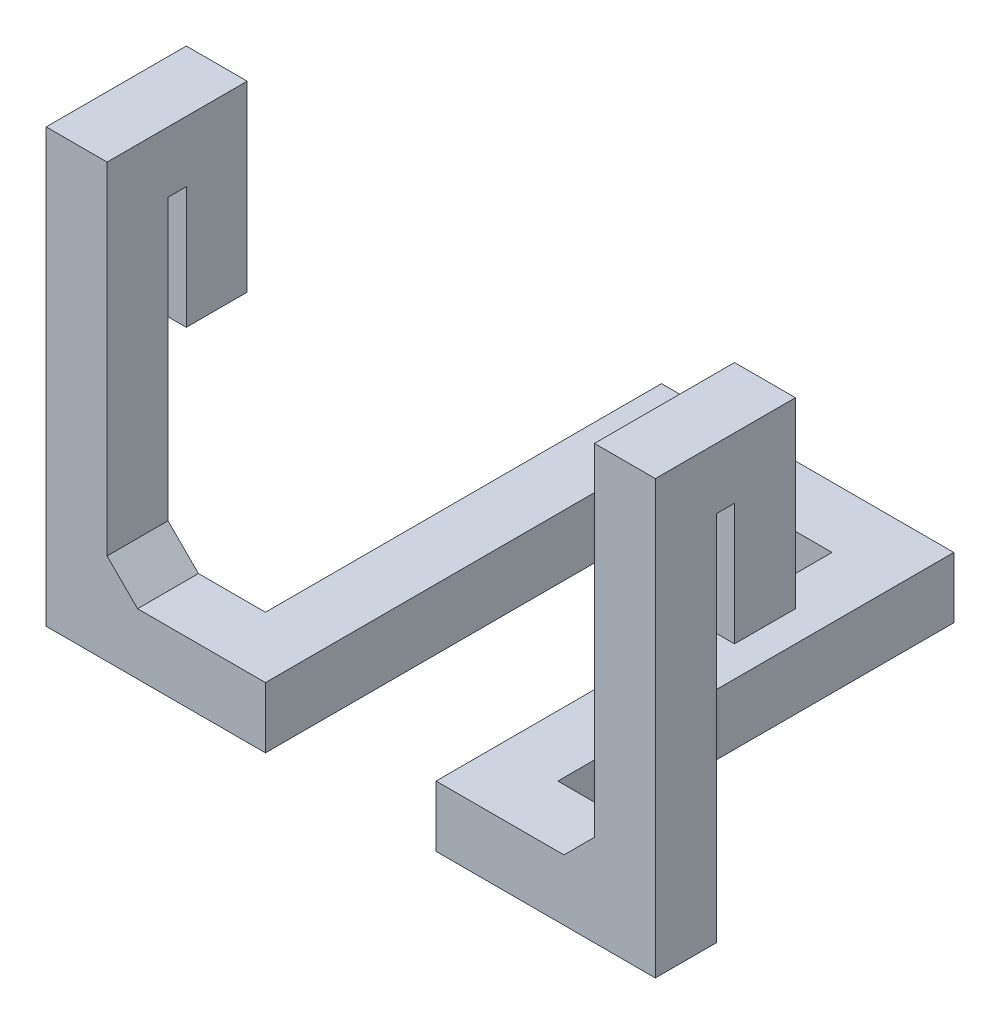
ISO-10303-21;
HEADER;
FILE_DESCRIPTION(('STEP AP214'),'2;1');
FILE_NAME('part.step','',(''),(''),'','','');
FILE_SCHEMA(('AUTOMOTIVE_DESIGN { 1 0 10303 214 1 1 1 1 }'));
ENDSEC;
DATA;
#1=APPLICATION_CONTEXT('core data for automotive mechanical design processes');
#2=APPLICATION_PROTOCOL_DEFINITION('international standard','automotive_design',2000,#1);
#3=PRODUCT_CONTEXT('',#1,'mechanical');
#4=PRODUCT('Part','Part','',(#3));
#5=PRODUCT_RELATED_PRODUCT_CATEGORY('part','',(#4));
#6=PRODUCT_DEFINITION_FORMATION('','',#4);
#7=PRODUCT_DEFINITION_CONTEXT('part definition',#1,'design');
#8=PRODUCT_DEFINITION('design','',#6,#7);
#9=PRODUCT_DEFINITION_SHAPE('','',#8);
#10=(LENGTH_UNIT() NAMED_UNIT(*) SI_UNIT(.MILLI.,.METRE.));
#11=(NAMED_UNIT(*) PLANE_ANGLE_UNIT() SI_UNIT($,.RADIAN.));
#12=(NAMED_UNIT(*) SI_UNIT($,.STERADIAN.) SOLID_ANGLE_UNIT());
#13=UNCERTAINTY_MEASURE_WITH_UNIT(LENGTH_MEASURE(1.E-05),#10,'distance_accuracy_value','');
#14=(GEOMETRIC_REPRESENTATION_CONTEXT(3) GLOBAL_UNCERTAINTY_ASSIGNED_CONTEXT((#13)) GLOBAL_UNIT_ASSIGNED_CONTEXT((#10,
#11,#12)) REPRESENTATION_CONTEXT('',''));
#15=CARTESIAN_POINT('',(0.,0.,0.));
#16=DIRECTION('',(0.,0.,1.));
#17=DIRECTION('',(1.,0.,0.));
#18=AXIS2_PLACEMENT_3D('',#15,#16,#17);
#19=CARTESIAN_POINT('',(10.,0.,0.));
#20=DIRECTION('',(0.,1.,0.));
#21=DIRECTION('',(0.,0.,1.));
#22=AXIS2_PLACEMENT_3D('',#19,#20,#21);
#23=PLANE('',#22);
#24=DIRECTION('',(0.,0.,-1.));
#25=VECTOR('',#24,1.);
#26=CARTESIAN_POINT('',(0.,0.,0.));
#27=LINE('',#26,#25);
#28=CARTESIAN_POINT('',(0.,0.,0.));
#29=VERTEX_POINT('',#28);
#30=CARTESIAN_POINT('',(0.,0.,-10.));
#31=VERTEX_POINT('',#30);
#32=EDGE_CURVE('E348',#29,#31,#27,.T.);
#33=ORIENTED_EDGE('',*,*,#32,.T.);
#34=DIRECTION('',(-1.,0.,0.));
#35=VECTOR('',#34,1.);
#36=CARTESIAN_POINT('',(10.,0.,-10.));
#37=LINE('',#36,#35);
#38=CARTESIAN_POINT('',(26.,0.,-10.));
#39=VERTEX_POINT('',#38);
#40=EDGE_CURVE('E400',#39,#31,#37,.T.);
#41=ORIENTED_EDGE('',*,*,#40,.F.);
#42=DIRECTION('',(0.,0.,1.));
#43=VECTOR('',#42,1.);
#44=CARTESIAN_POINT('',(26.,0.,-10.));
#45=LINE('',#44,#43);
#46=CARTESIAN_POINT('',(26.,0.,-75.));
#47=VERTEX_POINT('',#46);
#48=EDGE_CURVE('E293',#47,#39,#45,.T.);
#49=ORIENTED_EDGE('',*,*,#48,.F.);
#50=DIRECTION('',(-1.,0.,0.));
#51=VECTOR('',#50,1.);
#52=CARTESIAN_POINT('',(26.,0.,-75.));
#53=LINE('',#52,#51);
#54=CARTESIAN_POINT('',(74.,0.,-75.));
#55=VERTEX_POINT('',#54);
#56=EDGE_CURVE('E322',#55,#47,#53,.T.);
#57=ORIENTED_EDGE('',*,*,#56,.F.);
#58=DIRECTION('',(0.,0.,-1.));
#59=VECTOR('',#58,1.);
#60=CARTESIAN_POINT('',(74.,0.,-10.));
#61=LINE('',#60,#59);
#62=CARTESIAN_POINT('',(74.,0.,-10.));
#63=VERTEX_POINT('',#62);
#64=EDGE_CURVE('E229',#63,#55,#61,.T.);
#65=ORIENTED_EDGE('',*,*,#64,.F.);
#66=DIRECTION('',(-1.,0.,0.));
#67=VECTOR('',#66,1.);
#68=CARTESIAN_POINT('',(90.,0.,-10.));
#69=LINE('',#68,#67);
#70=CARTESIAN_POINT('',(100.,0.,-10.));
#71=VERTEX_POINT('',#70);
#72=EDGE_CURVE('E222',#71,#63,#69,.T.);
#73=ORIENTED_EDGE('',*,*,#72,.F.);
#74=DIRECTION('',(0.,0.,-1.));
#75=VECTOR('',#74,1.);
#76=CARTESIAN_POINT('',(100.,0.,0.));
#77=LINE('',#76,#75);
#78=CARTESIAN_POINT('',(100.,0.,0.));
#79=VERTEX_POINT('',#78);
#80=EDGE_CURVE('E227',#79,#71,#77,.T.);
#81=ORIENTED_EDGE('',*,*,#80,.F.);
#82=DIRECTION('',(1.,0.,0.));
#83=VECTOR('',#82,1.);
#84=CARTESIAN_POINT('',(90.,0.,0.));
#85=LINE('',#84,#83);
#86=CARTESIAN_POINT('',(64.,0.,0.));
#87=VERTEX_POINT('',#86);
#88=EDGE_CURVE('E232',#87,#79,#85,.T.);
#89=ORIENTED_EDGE('',*,*,#88,.F.);
#90=DIRECTION('',(0.,0.,1.));
#91=VECTOR('',#90,1.);
#92=CARTESIAN_POINT('',(64.,0.,0.));
#93=LINE('',#92,#91);
#94=CARTESIAN_POINT('',(64.,0.,-65.));
#95=VERTEX_POINT('',#94);
#96=EDGE_CURVE('E318',#95,#87,#93,.T.);
#97=ORIENTED_EDGE('',*,*,#96,.F.);
#98=DIRECTION('',(1.,0.,0.));
#99=VECTOR('',#98,1.);
#100=CARTESIAN_POINT('',(64.,0.,-65.));
#101=LINE('',#100,#99);
#102=CARTESIAN_POINT('',(36.,0.,-65.));
#103=VERTEX_POINT('',#102);
#104=EDGE_CURVE('E316',#103,#95,#101,.T.);
#105=ORIENTED_EDGE('',*,*,#104,.F.);
#106=DIRECTION('',(0.,0.,-1.));
#107=VECTOR('',#106,1.);
#108=CARTESIAN_POINT('',(36.,0.,0.));
#109=LINE('',#108,#107);
#110=CARTESIAN_POINT('',(36.,0.,0.));
#111=VERTEX_POINT('',#110);
#112=EDGE_CURVE('E289',#111,#103,#109,.T.);
#113=ORIENTED_EDGE('',*,*,#112,.F.);
#114=DIRECTION('',(-1.,0.,0.));
#115=VECTOR('',#114,1.);
#116=CARTESIAN_POINT('',(10.,0.,0.));
#117=LINE('',#116,#115);
#118=EDGE_CURVE('E365',#111,#29,#117,.T.);
#119=ORIENTED_EDGE('',*,*,#118,.T.);
#120=EDGE_LOOP('',(#33,#41,#49,#57,#65,#73,#81,#89,#97,#105,#113,#119));
#121=FACE_BOUND('',#120,.T.);
#122=ADVANCED_FACE('F49',(#121),#23,.F.);
#123=CARTESIAN_POINT('',(10.,0.,-10.));
#124=DIRECTION('',(0.,0.,1.));
#125=DIRECTION('',(1.,0.,0.));
#126=AXIS2_PLACEMENT_3D('',#123,#124,#125);
#127=PLANE('',#126);
#128=DIRECTION('',(0.,1.,0.));
#129=VECTOR('',#128,1.);
#130=CARTESIAN_POINT('',(0.,0.,-10.));
#131=LINE('',#130,#129);
#132=CARTESIAN_POINT('',(0.,61.,-10.));
#133=VERTEX_POINT('',#132);
#134=EDGE_CURVE('E367',#31,#133,#131,.T.);
#135=ORIENTED_EDGE('',*,*,#134,.T.);
#136=DIRECTION('',(-1.,0.,0.));
#137=VECTOR('',#136,1.);
#138=CARTESIAN_POINT('',(10.,61.,-10.));
#139=LINE('',#138,#137);
#140=CARTESIAN_POINT('',(10.,61.,-10.));
#141=VERTEX_POINT('',#140);
#142=EDGE_CURVE('E397',#141,#133,#139,.T.);
#143=ORIENTED_EDGE('',*,*,#142,.F.);
#144=DIRECTION('',(0.,1.,0.));
#145=VECTOR('',#144,1.);
#146=CARTESIAN_POINT('',(10.,0.,-10.));
#147=LINE('',#146,#145);
#148=CARTESIAN_POINT('',(10.,15.,-10.));
#149=VERTEX_POINT('',#148);
#150=EDGE_CURVE('E349',#149,#141,#147,.T.);
#151=ORIENTED_EDGE('',*,*,#150,.F.);
#152=DIRECTION('',(-0.707106781186548,0.707106781186548,0.));
#153=VECTOR('',#152,1.);
#154=CARTESIAN_POINT('',(17.5,7.5,-10.));
#155=LINE('',#154,#153);
#156=CARTESIAN_POINT('',(15.,10.,-10.));
#157=VERTEX_POINT('',#156);
#158=EDGE_CURVE('E414',#149,#157,#155,.F.);
#159=ORIENTED_EDGE('',*,*,#158,.T.);
#160=DIRECTION('',(-1.,0.,0.));
#161=VECTOR('',#160,1.);
#162=CARTESIAN_POINT('',(10.,10.,-10.));
#163=LINE('',#162,#161);
#164=CARTESIAN_POINT('',(26.,10.,-10.));
#165=VERTEX_POINT('',#164);
#166=EDGE_CURVE('E310',#165,#157,#163,.T.);
#167=ORIENTED_EDGE('',*,*,#166,.F.);
#168=DIRECTION('',(0.,-1.,0.));
#169=VECTOR('',#168,1.);
#170=CARTESIAN_POINT('',(26.,10.,-10.));
#171=LINE('',#170,#169);
#172=EDGE_CURVE('E313',#165,#39,#171,.T.);
#173=ORIENTED_EDGE('',*,*,#172,.T.);
#174=ORIENTED_EDGE('',*,*,#40,.T.);
#175=EDGE_LOOP('',(#135,#143,#151,#159,#167,#173,#174));
#176=FACE_BOUND('',#175,.T.);
#177=ADVANCED_FACE('F419',(#176),#127,.F.);
#178=CARTESIAN_POINT('',(10.,61.,-10.));
#179=DIRECTION('',(0.,1.,0.));
#180=DIRECTION('',(0.,0.,1.));
#181=AXIS2_PLACEMENT_3D('',#178,#179,#180);
#182=PLANE('',#181);
#183=DIRECTION('',(0.,0.,-1.));
#184=VECTOR('',#183,1.);
#185=CARTESIAN_POINT('',(0.,61.,-10.));
#186=LINE('',#185,#184);
#187=CARTESIAN_POINT('',(0.,61.,-13.));
#188=VERTEX_POINT('',#187);
#189=EDGE_CURVE('E369',#133,#188,#186,.T.);
#190=ORIENTED_EDGE('',*,*,#189,.T.);
#191=DIRECTION('',(-1.,0.,0.));
#192=VECTOR('',#191,1.);
#193=CARTESIAN_POINT('',(10.,61.,-13.));
#194=LINE('',#193,#192);
#195=CARTESIAN_POINT('',(10.,61.,-13.));
#196=VERTEX_POINT('',#195);
#197=EDGE_CURVE('E394',#196,#188,#194,.T.);
#198=ORIENTED_EDGE('',*,*,#197,.F.);
#199=DIRECTION('',(0.,0.,-1.));
#200=VECTOR('',#199,1.);
#201=CARTESIAN_POINT('',(10.,61.,-10.));
#202=LINE('',#201,#200);
#203=EDGE_CURVE('E351',#141,#196,#202,.T.);
#204=ORIENTED_EDGE('',*,*,#203,.F.);
#205=ORIENTED_EDGE('',*,*,#142,.T.);
#206=EDGE_LOOP('',(#190,#198,#204,#205));
#207=FACE_BOUND('',#206,.T.);
#208=ADVANCED_FACE('F482',(#207),#182,.F.);
#209=CARTESIAN_POINT('',(10.,61.,-13.));
#210=DIRECTION('',(0.,0.,-1.));
#211=DIRECTION('',(0.,1.,0.));
#212=AXIS2_PLACEMENT_3D('',#209,#210,#211);
#213=PLANE('',#212);
#214=DIRECTION('',(0.,-1.,0.));
#215=VECTOR('',#214,1.);
#216=CARTESIAN_POINT('',(0.,61.,-13.));
#217=LINE('',#216,#215);
#218=CARTESIAN_POINT('',(0.,41.,-13.));
#219=VERTEX_POINT('',#218);
#220=EDGE_CURVE('E371',#188,#219,#217,.T.);
#221=ORIENTED_EDGE('',*,*,#220,.T.);
#222=DIRECTION('',(-1.,0.,0.));
#223=VECTOR('',#222,1.);
#224=CARTESIAN_POINT('',(10.,41.,-13.));
#225=LINE('',#224,#223);
#226=CARTESIAN_POINT('',(10.,41.,-13.));
#227=VERTEX_POINT('',#226);
#228=EDGE_CURVE('E391',#227,#219,#225,.T.);
#229=ORIENTED_EDGE('',*,*,#228,.F.);
#230=DIRECTION('',(0.,-1.,0.));
#231=VECTOR('',#230,1.);
#232=CARTESIAN_POINT('',(10.,61.,-13.));
#233=LINE('',#232,#231);
#234=EDGE_CURVE('E354',#196,#227,#233,.T.);
#235=ORIENTED_EDGE('',*,*,#234,.F.);
#236=ORIENTED_EDGE('',*,*,#197,.T.);
#237=EDGE_LOOP('',(#221,#229,#235,#236));
#238=FACE_BOUND('',#237,.T.);
#239=ADVANCED_FACE('F492',(#238),#213,.F.);
#240=CARTESIAN_POINT('',(10.,41.,-13.));
#241=DIRECTION('',(0.,1.,0.));
#242=DIRECTION('',(0.,0.,1.));
#243=AXIS2_PLACEMENT_3D('',#240,#241,#242);
#244=PLANE('',#243);
#245=DIRECTION('',(0.,0.,-1.));
#246=VECTOR('',#245,1.);
#247=CARTESIAN_POINT('',(0.,41.,-13.));
#248=LINE('',#247,#246);
#249=CARTESIAN_POINT('',(0.,41.,-23.));
#250=VERTEX_POINT('',#249);
#251=EDGE_CURVE('E373',#219,#250,#248,.T.);
#252=ORIENTED_EDGE('',*,*,#251,.T.);
#253=DIRECTION('',(-1.,0.,0.));
#254=VECTOR('',#253,1.);
#255=CARTESIAN_POINT('',(10.,41.,-23.));
#256=LINE('',#255,#254);
#257=CARTESIAN_POINT('',(10.,41.,-23.));
#258=VERTEX_POINT('',#257);
#259=EDGE_CURVE('E388',#258,#250,#256,.T.);
#260=ORIENTED_EDGE('',*,*,#259,.F.);
#261=DIRECTION('',(0.,0.,-1.));
#262=VECTOR('',#261,1.);
#263=CARTESIAN_POINT('',(10.,41.,-13.));
#264=LINE('',#263,#262);
#265=EDGE_CURVE('E356',#227,#258,#264,.T.);
#266=ORIENTED_EDGE('',*,*,#265,.F.);
#267=ORIENTED_EDGE('',*,*,#228,.T.);
#268=EDGE_LOOP('',(#252,#260,#266,#267));
#269=FACE_BOUND('',#268,.T.);
#270=ADVANCED_FACE('F496',(#269),#244,.F.);
#271=CARTESIAN_POINT('',(10.,71.,-23.));
#272=DIRECTION('',(0.,0.,1.));
#273=DIRECTION('',(1.,0.,0.));
#274=AXIS2_PLACEMENT_3D('',#271,#272,#273);
#275=PLANE('',#274);
#276=DIRECTION('',(0.,1.,0.));
#277=VECTOR('',#276,1.);
#278=CARTESIAN_POINT('',(0.,71.,-23.));
#279=LINE('',#278,#277);
#280=CARTESIAN_POINT('',(0.,71.,-23.));
#281=VERTEX_POINT('',#280);
#282=EDGE_CURVE('E375',#250,#281,#279,.T.);
#283=ORIENTED_EDGE('',*,*,#282,.T.);
#284=DIRECTION('',(-1.,0.,0.));
#285=VECTOR('',#284,1.);
#286=CARTESIAN_POINT('',(10.,71.,-23.));
#287=LINE('',#286,#285);
#288=CARTESIAN_POINT('',(10.,71.,-23.));
#289=VERTEX_POINT('',#288);
#290=EDGE_CURVE('E385',#289,#281,#287,.T.);
#291=ORIENTED_EDGE('',*,*,#290,.F.);
#292=DIRECTION('',(0.,1.,0.));
#293=VECTOR('',#292,1.);
#294=CARTESIAN_POINT('',(10.,71.,-23.));
#295=LINE('',#294,#293);
#296=EDGE_CURVE('E358',#258,#289,#295,.T.);
#297=ORIENTED_EDGE('',*,*,#296,.F.);
#298=ORIENTED_EDGE('',*,*,#259,.T.);
#299=EDGE_LOOP('',(#283,#291,#297,#298));
#300=FACE_BOUND('',#299,.T.);
#301=ADVANCED_FACE('F500',(#300),#275,.F.);
#302=CARTESIAN_POINT('',(10.,71.,0.));
#303=DIRECTION('',(0.,-1.,0.));
#304=DIRECTION('',(0.,0.,-1.));
#305=AXIS2_PLACEMENT_3D('',#302,#303,#304);
#306=PLANE('',#305);
#307=DIRECTION('',(0.,0.,1.));
#308=VECTOR('',#307,1.);
#309=CARTESIAN_POINT('',(0.,71.,0.));
#310=LINE('',#309,#308);
#311=CARTESIAN_POINT('',(0.,71.,0.));
#312=VERTEX_POINT('',#311);
#313=EDGE_CURVE('E377',#281,#312,#310,.T.);
#314=ORIENTED_EDGE('',*,*,#313,.T.);
#315=DIRECTION('',(-1.,0.,0.));
#316=VECTOR('',#315,1.);
#317=CARTESIAN_POINT('',(10.,71.,0.));
#318=LINE('',#317,#316);
#319=CARTESIAN_POINT('',(10.,71.,0.));
#320=VERTEX_POINT('',#319);
#321=EDGE_CURVE('E382',#320,#312,#318,.T.);
#322=ORIENTED_EDGE('',*,*,#321,.F.);
#323=DIRECTION('',(0.,0.,1.));
#324=VECTOR('',#323,1.);
#325=CARTESIAN_POINT('',(10.,71.,0.));
#326=LINE('',#325,#324);
#327=EDGE_CURVE('E360',#289,#320,#326,.T.);
#328=ORIENTED_EDGE('',*,*,#327,.F.);
#329=ORIENTED_EDGE('',*,*,#290,.T.);
#330=EDGE_LOOP('',(#314,#322,#328,#329));
#331=FACE_BOUND('',#330,.T.);
#332=ADVANCED_FACE('F441',(#331),#306,.F.);
#333=CARTESIAN_POINT('',(10.,0.,0.));
#334=DIRECTION('',(0.,0.,-1.));
#335=DIRECTION('',(-1.,0.,0.));
#336=AXIS2_PLACEMENT_3D('',#333,#334,#335);
#337=PLANE('',#336);
#338=DIRECTION('',(0.,-1.,0.));
#339=VECTOR('',#338,1.);
#340=CARTESIAN_POINT('',(0.,0.,0.));
#341=LINE('',#340,#339);
#342=EDGE_CURVE('E352',#312,#29,#341,.T.);
#343=ORIENTED_EDGE('',*,*,#342,.T.);
#344=ORIENTED_EDGE('',*,*,#118,.F.);
#345=DIRECTION('',(0.,-1.,0.));
#346=VECTOR('',#345,1.);
#347=CARTESIAN_POINT('',(36.,10.,0.));
#348=LINE('',#347,#346);
#349=CARTESIAN_POINT('',(36.,10.,0.));
#350=VERTEX_POINT('',#349);
#351=EDGE_CURVE('E345',#350,#111,#348,.T.);
#352=ORIENTED_EDGE('',*,*,#351,.F.);
#353=DIRECTION('',(1.,0.,0.));
#354=VECTOR('',#353,1.);
#355=CARTESIAN_POINT('',(10.,10.,0.));
#356=LINE('',#355,#354);
#357=CARTESIAN_POINT('',(15.,10.,0.));
#358=VERTEX_POINT('',#357);
#359=EDGE_CURVE('E290',#358,#350,#356,.T.);
#360=ORIENTED_EDGE('',*,*,#359,.F.);
#361=DIRECTION('',(0.707106781186548,-0.707106781186548,0.));
#362=VECTOR('',#361,1.);
#363=CARTESIAN_POINT('',(17.5,7.5,0.));
#364=LINE('',#363,#362);
#365=CARTESIAN_POINT('',(10.,15.,0.));
#366=VERTEX_POINT('',#365);
#367=EDGE_CURVE('E412',#358,#366,#364,.F.);
#368=ORIENTED_EDGE('',*,*,#367,.T.);
#369=DIRECTION('',(0.,-1.,0.));
#370=VECTOR('',#369,1.);
#371=CARTESIAN_POINT('',(10.,0.,0.));
#372=LINE('',#371,#370);
#373=EDGE_CURVE('E362',#320,#366,#372,.T.);
#374=ORIENTED_EDGE('',*,*,#373,.F.);
#375=ORIENTED_EDGE('',*,*,#321,.T.);
#376=EDGE_LOOP('',(#343,#344,#352,#360,#368,#374,#375));
#377=FACE_BOUND('',#376,.T.);
#378=ADVANCED_FACE('F432',(#377),#337,.F.);
#379=CARTESIAN_POINT('',(10.,0.,0.));
#380=DIRECTION('',(1.,0.,0.));
#381=DIRECTION('',(0.,0.,-1.));
#382=AXIS2_PLACEMENT_3D('',#379,#380,#381);
#383=PLANE('',#382);
#384=ORIENTED_EDGE('',*,*,#373,.T.);
#385=DIRECTION('',(0.,0.,-1.));
#386=VECTOR('',#385,1.);
#387=CARTESIAN_POINT('',(10.,15.,-10.));
#388=LINE('',#387,#386);
#389=EDGE_CURVE('E409',#366,#149,#388,.T.);
#390=ORIENTED_EDGE('',*,*,#389,.T.);
#391=ORIENTED_EDGE('',*,*,#150,.T.);
#392=ORIENTED_EDGE('',*,*,#203,.T.);
#393=ORIENTED_EDGE('',*,*,#234,.T.);
#394=ORIENTED_EDGE('',*,*,#265,.T.);
#395=ORIENTED_EDGE('',*,*,#296,.T.);
#396=ORIENTED_EDGE('',*,*,#327,.T.);
#397=EDGE_LOOP('',(#384,#390,#391,#392,#393,#394,#395,#396));
#398=FACE_BOUND('',#397,.T.);
#399=ADVANCED_FACE('F435',(#398),#383,.T.);
#400=CARTESIAN_POINT('',(0.,0.,0.));
#401=DIRECTION('',(1.,0.,0.));
#402=DIRECTION('',(0.,0.,-1.));
#403=AXIS2_PLACEMENT_3D('',#400,#401,#402);
#404=PLANE('',#403);
#405=ORIENTED_EDGE('',*,*,#32,.F.);
#406=ORIENTED_EDGE('',*,*,#342,.F.);
#407=ORIENTED_EDGE('',*,*,#313,.F.);
#408=ORIENTED_EDGE('',*,*,#282,.F.);
#409=ORIENTED_EDGE('',*,*,#251,.F.);
#410=ORIENTED_EDGE('',*,*,#220,.F.);
#411=ORIENTED_EDGE('',*,*,#189,.F.);
#412=ORIENTED_EDGE('',*,*,#134,.F.);
#413=EDGE_LOOP('',(#405,#406,#407,#408,#409,#410,#411,#412));
#414=FACE_BOUND('',#413,.T.);
#415=ADVANCED_FACE('F446',(#414),#404,.F.);
#416=CARTESIAN_POINT('',(36.,10.,0.));
#417=DIRECTION('',(-1.,0.,0.));
#418=DIRECTION('',(0.,0.,1.));
#419=AXIS2_PLACEMENT_3D('',#416,#417,#418);
#420=PLANE('',#419);
#421=ORIENTED_EDGE('',*,*,#112,.T.);
#422=DIRECTION('',(0.,-1.,0.));
#423=VECTOR('',#422,1.);
#424=CARTESIAN_POINT('',(36.,10.,-65.));
#425=LINE('',#424,#423);
#426=CARTESIAN_POINT('',(36.,10.,-65.));
#427=VERTEX_POINT('',#426);
#428=EDGE_CURVE('E342',#427,#103,#425,.T.);
#429=ORIENTED_EDGE('',*,*,#428,.F.);
#430=DIRECTION('',(0.,0.,-1.));
#431=VECTOR('',#430,1.);
#432=CARTESIAN_POINT('',(36.,10.,0.));
#433=LINE('',#432,#431);
#434=EDGE_CURVE('E292',#350,#427,#433,.T.);
#435=ORIENTED_EDGE('',*,*,#434,.F.);
#436=ORIENTED_EDGE('',*,*,#351,.T.);
#437=EDGE_LOOP('',(#421,#429,#435,#436));
#438=FACE_BOUND('',#437,.T.);
#439=ADVANCED_FACE('F453',(#438),#420,.F.);
#440=CARTESIAN_POINT('',(64.,10.,-65.));
#441=DIRECTION('',(0.,0.,-1.));
#442=DIRECTION('',(-1.,0.,0.));
#443=AXIS2_PLACEMENT_3D('',#440,#441,#442);
#444=PLANE('',#443);
#445=ORIENTED_EDGE('',*,*,#104,.T.);
#446=DIRECTION('',(0.,-1.,0.));
#447=VECTOR('',#446,1.);
#448=CARTESIAN_POINT('',(64.,10.,-65.));
#449=LINE('',#448,#447);
#450=CARTESIAN_POINT('',(64.,10.,-65.));
#451=VERTEX_POINT('',#450);
#452=EDGE_CURVE('E339',#451,#95,#449,.T.);
#453=ORIENTED_EDGE('',*,*,#452,.F.);
#454=DIRECTION('',(1.,0.,0.));
#455=VECTOR('',#454,1.);
#456=CARTESIAN_POINT('',(36.,10.,-65.));
#457=LINE('',#456,#455);
#458=EDGE_CURVE('E295',#427,#451,#457,.T.);
#459=ORIENTED_EDGE('',*,*,#458,.F.);
#460=ORIENTED_EDGE('',*,*,#428,.T.);
#461=EDGE_LOOP('',(#445,#453,#459,#460));
#462=FACE_BOUND('',#461,.T.);
#463=ADVANCED_FACE('F460',(#462),#444,.F.);
#464=CARTESIAN_POINT('',(64.,10.,0.));
#465=DIRECTION('',(1.,0.,0.));
#466=DIRECTION('',(0.,0.,-1.));
#467=AXIS2_PLACEMENT_3D('',#464,#465,#466);
#468=PLANE('',#467);
#469=ORIENTED_EDGE('',*,*,#96,.T.);
#470=DIRECTION('',(0.,-1.,0.));
#471=VECTOR('',#470,1.);
#472=CARTESIAN_POINT('',(64.,10.,0.));
#473=LINE('',#472,#471);
#474=CARTESIAN_POINT('',(64.,10.,0.));
#475=VERTEX_POINT('',#474);
#476=EDGE_CURVE('E336',#475,#87,#473,.T.);
#477=ORIENTED_EDGE('',*,*,#476,.F.);
#478=DIRECTION('',(0.,0.,1.));
#479=VECTOR('',#478,1.);
#480=CARTESIAN_POINT('',(64.,10.,0.));
#481=LINE('',#480,#479);
#482=EDGE_CURVE('E297',#451,#475,#481,.T.);
#483=ORIENTED_EDGE('',*,*,#482,.F.);
#484=ORIENTED_EDGE('',*,*,#452,.T.);
#485=EDGE_LOOP('',(#469,#477,#483,#484));
#486=FACE_BOUND('',#485,.T.);
#487=ADVANCED_FACE('F463',(#486),#468,.F.);
#488=CARTESIAN_POINT('',(90.,10.,0.));
#489=DIRECTION('',(0.,0.,-1.));
#490=DIRECTION('',(-1.,0.,0.));
#491=AXIS2_PLACEMENT_3D('',#488,#489,#490);
#492=PLANE('',#491);
#493=ORIENTED_EDGE('',*,*,#88,.T.);
#494=DIRECTION('',(0.,-1.,0.));
#495=VECTOR('',#494,1.);
#496=CARTESIAN_POINT('',(100.,71.,0.));
#497=LINE('',#496,#495);
#498=CARTESIAN_POINT('',(100.,71.,0.));
#499=VERTEX_POINT('',#498);
#500=EDGE_CURVE('E246',#499,#79,#497,.T.);
#501=ORIENTED_EDGE('',*,*,#500,.F.);
#502=DIRECTION('',(-1.,0.,0.));
#503=VECTOR('',#502,1.);
#504=CARTESIAN_POINT('',(100.,71.,0.));
#505=LINE('',#504,#503);
#506=CARTESIAN_POINT('',(90.,71.,0.));
#507=VERTEX_POINT('',#506);
#508=EDGE_CURVE('E262',#499,#507,#505,.T.);
#509=ORIENTED_EDGE('',*,*,#508,.T.);
#510=DIRECTION('',(0.,-1.,0.));
#511=VECTOR('',#510,1.);
#512=CARTESIAN_POINT('',(90.,71.,0.));
#513=LINE('',#512,#511);
#514=CARTESIAN_POINT('',(90.,15.,0.));
#515=VERTEX_POINT('',#514);
#516=EDGE_CURVE('E247',#507,#515,#513,.T.);
#517=ORIENTED_EDGE('',*,*,#516,.T.);
#518=DIRECTION('',(-0.707106781186548,-0.707106781186547,0.));
#519=VECTOR('',#518,1.);
#520=CARTESIAN_POINT('',(87.5,12.5,0.));
#521=LINE('',#520,#519);
#522=CARTESIAN_POINT('',(85.,10.,0.));
#523=VERTEX_POINT('',#522);
#524=EDGE_CURVE('E13',#515,#523,#521,.T.);
#525=ORIENTED_EDGE('',*,*,#524,.T.);
#526=DIRECTION('',(1.,0.,0.));
#527=VECTOR('',#526,1.);
#528=CARTESIAN_POINT('',(90.,10.,0.));
#529=LINE('',#528,#527);
#530=EDGE_CURVE('E299',#475,#523,#529,.T.);
#531=ORIENTED_EDGE('',*,*,#530,.F.);
#532=ORIENTED_EDGE('',*,*,#476,.T.);
#533=EDGE_LOOP('',(#493,#501,#509,#517,#525,#531,#532));
#534=FACE_BOUND('',#533,.T.);
#535=ADVANCED_FACE('F466',(#534),#492,.F.);
#536=CARTESIAN_POINT('',(90.,10.,-10.));
#537=DIRECTION('',(0.,0.,1.));
#538=DIRECTION('',(1.,0.,0.));
#539=AXIS2_PLACEMENT_3D('',#536,#537,#538);
#540=PLANE('',#539);
#541=ORIENTED_EDGE('',*,*,#72,.T.);
#542=DIRECTION('',(0.,-1.,0.));
#543=VECTOR('',#542,1.);
#544=CARTESIAN_POINT('',(74.,10.,-10.));
#545=LINE('',#544,#543);
#546=CARTESIAN_POINT('',(74.,10.,-10.));
#547=VERTEX_POINT('',#546);
#548=EDGE_CURVE('E334',#547,#63,#545,.T.);
#549=ORIENTED_EDGE('',*,*,#548,.F.);
#550=DIRECTION('',(-1.,0.,0.));
#551=VECTOR('',#550,1.);
#552=CARTESIAN_POINT('',(90.,10.,-10.));
#553=LINE('',#552,#551);
#554=CARTESIAN_POINT('',(85.,10.,-10.));
#555=VERTEX_POINT('',#554);
#556=EDGE_CURVE('E302',#555,#547,#553,.T.);
#557=ORIENTED_EDGE('',*,*,#556,.F.);
#558=DIRECTION('',(0.707106781186548,0.707106781186547,0.));
#559=VECTOR('',#558,1.);
#560=CARTESIAN_POINT('',(87.5,12.5,-10.));
#561=LINE('',#560,#559);
#562=CARTESIAN_POINT('',(90.,15.,-10.));
#563=VERTEX_POINT('',#562);
#564=EDGE_CURVE('E58',#555,#563,#561,.T.);
#565=ORIENTED_EDGE('',*,*,#564,.T.);
#566=DIRECTION('',(0.,1.,0.));
#567=VECTOR('',#566,1.);
#568=CARTESIAN_POINT('',(90.,0.,-10.));
#569=LINE('',#568,#567);
#570=CARTESIAN_POINT('',(90.,61.,-10.));
#571=VERTEX_POINT('',#570);
#572=EDGE_CURVE('E263',#563,#571,#569,.T.);
#573=ORIENTED_EDGE('',*,*,#572,.T.);
#574=DIRECTION('',(-1.,0.,0.));
#575=VECTOR('',#574,1.);
#576=CARTESIAN_POINT('',(100.,61.,-10.));
#577=LINE('',#576,#575);
#578=CARTESIAN_POINT('',(100.,61.,-10.));
#579=VERTEX_POINT('',#578);
#580=EDGE_CURVE('E238',#579,#571,#577,.T.);
#581=ORIENTED_EDGE('',*,*,#580,.F.);
#582=DIRECTION('',(0.,1.,0.));
#583=VECTOR('',#582,1.);
#584=CARTESIAN_POINT('',(100.,0.,-10.));
#585=LINE('',#584,#583);
#586=EDGE_CURVE('E235',#71,#579,#585,.T.);
#587=ORIENTED_EDGE('',*,*,#586,.F.);
#588=EDGE_LOOP('',(#541,#549,#557,#565,#573,#581,#587));
#589=FACE_BOUND('',#588,.T.);
#590=ADVANCED_FACE('F236',(#589),#540,.F.);
#591=CARTESIAN_POINT('',(74.,10.,-10.));
#592=DIRECTION('',(-1.,0.,0.));
#593=DIRECTION('',(0.,0.,1.));
#594=AXIS2_PLACEMENT_3D('',#591,#592,#593);
#595=PLANE('',#594);
#596=ORIENTED_EDGE('',*,*,#64,.T.);
#597=DIRECTION('',(0.,-1.,0.));
#598=VECTOR('',#597,1.);
#599=CARTESIAN_POINT('',(74.,10.,-75.));
#600=LINE('',#599,#598);
#601=CARTESIAN_POINT('',(74.,10.,-75.));
#602=VERTEX_POINT('',#601);
#603=EDGE_CURVE('E331',#602,#55,#600,.T.);
#604=ORIENTED_EDGE('',*,*,#603,.F.);
#605=DIRECTION('',(0.,0.,-1.));
#606=VECTOR('',#605,1.);
#607=CARTESIAN_POINT('',(74.,10.,-10.));
#608=LINE('',#607,#606);
#609=EDGE_CURVE('E304',#547,#602,#608,.T.);
#610=ORIENTED_EDGE('',*,*,#609,.F.);
#611=ORIENTED_EDGE('',*,*,#548,.T.);
#612=EDGE_LOOP('',(#596,#604,#610,#611));
#613=FACE_BOUND('',#612,.T.);
#614=ADVANCED_FACE('F523',(#613),#595,.F.);
#615=CARTESIAN_POINT('',(26.,10.,-75.));
#616=DIRECTION('',(0.,0.,1.));
#617=DIRECTION('',(1.,0.,0.));
#618=AXIS2_PLACEMENT_3D('',#615,#616,#617);
#619=PLANE('',#618);
#620=ORIENTED_EDGE('',*,*,#56,.T.);
#621=DIRECTION('',(0.,-1.,0.));
#622=VECTOR('',#621,1.);
#623=CARTESIAN_POINT('',(26.,10.,-75.));
#624=LINE('',#623,#622);
#625=CARTESIAN_POINT('',(26.,10.,-75.));
#626=VERTEX_POINT('',#625);
#627=EDGE_CURVE('E328',#626,#47,#624,.T.);
#628=ORIENTED_EDGE('',*,*,#627,.F.);
#629=DIRECTION('',(-1.,0.,0.));
#630=VECTOR('',#629,1.);
#631=CARTESIAN_POINT('',(74.,10.,-75.));
#632=LINE('',#631,#630);
#633=EDGE_CURVE('E306',#602,#626,#632,.T.);
#634=ORIENTED_EDGE('',*,*,#633,.F.);
#635=ORIENTED_EDGE('',*,*,#603,.T.);
#636=EDGE_LOOP('',(#620,#628,#634,#635));
#637=FACE_BOUND('',#636,.T.);
#638=ADVANCED_FACE('F526',(#637),#619,.F.);
#639=CARTESIAN_POINT('',(26.,10.,-10.));
#640=DIRECTION('',(1.,0.,0.));
#641=DIRECTION('',(0.,0.,-1.));
#642=AXIS2_PLACEMENT_3D('',#639,#640,#641);
#643=PLANE('',#642);
#644=ORIENTED_EDGE('',*,*,#48,.T.);
#645=ORIENTED_EDGE('',*,*,#172,.F.);
#646=DIRECTION('',(0.,0.,1.));
#647=VECTOR('',#646,1.);
#648=CARTESIAN_POINT('',(26.,10.,-10.));
#649=LINE('',#648,#647);
#650=EDGE_CURVE('E308',#626,#165,#649,.T.);
#651=ORIENTED_EDGE('',*,*,#650,.F.);
#652=ORIENTED_EDGE('',*,*,#627,.T.);
#653=EDGE_LOOP('',(#644,#645,#651,#652));
#654=FACE_BOUND('',#653,.T.);
#655=ADVANCED_FACE('F530',(#654),#643,.F.);
#656=CARTESIAN_POINT('',(0.,10.,0.));
#657=DIRECTION('',(0.,1.,0.));
#658=DIRECTION('',(0.,0.,1.));
#659=AXIS2_PLACEMENT_3D('',#656,#657,#658);
#660=PLANE('',#659);
#661=ORIENTED_EDGE('',*,*,#166,.T.);
#662=DIRECTION('',(0.,0.,1.));
#663=VECTOR('',#662,1.);
#664=CARTESIAN_POINT('',(15.,10.,0.));
#665=LINE('',#664,#663);
#666=EDGE_CURVE('E406',#157,#358,#665,.T.);
#667=ORIENTED_EDGE('',*,*,#666,.T.);
#668=ORIENTED_EDGE('',*,*,#359,.T.);
#669=ORIENTED_EDGE('',*,*,#434,.T.);
#670=ORIENTED_EDGE('',*,*,#458,.T.);
#671=ORIENTED_EDGE('',*,*,#482,.T.);
#672=ORIENTED_EDGE('',*,*,#530,.T.);
#673=DIRECTION('',(0.,0.,-1.));
#674=VECTOR('',#673,1.);
#675=CARTESIAN_POINT('',(85.,10.,0.));
#676=LINE('',#675,#674);
#677=EDGE_CURVE('E403',#523,#555,#676,.T.);
#678=ORIENTED_EDGE('',*,*,#677,.T.);
#679=ORIENTED_EDGE('',*,*,#556,.T.);
#680=ORIENTED_EDGE('',*,*,#609,.T.);
#681=ORIENTED_EDGE('',*,*,#633,.T.);
#682=ORIENTED_EDGE('',*,*,#650,.T.);
#683=EDGE_LOOP('',(#661,#667,#668,#669,#670,#671,#672,#678,#679,#680,#681,#682));
#684=FACE_BOUND('',#683,.T.);
#685=ADVANCED_FACE('F425',(#684),#660,.T.);
#686=CARTESIAN_POINT('',(100.,61.,-10.));
#687=DIRECTION('',(0.,1.,0.));
#688=DIRECTION('',(0.,0.,1.));
#689=AXIS2_PLACEMENT_3D('',#686,#687,#688);
#690=PLANE('',#689);
#691=DIRECTION('',(0.,0.,-1.));
#692=VECTOR('',#691,1.);
#693=CARTESIAN_POINT('',(90.,61.,-10.));
#694=LINE('',#693,#692);
#695=CARTESIAN_POINT('',(90.,61.,-13.));
#696=VERTEX_POINT('',#695);
#697=EDGE_CURVE('E265',#571,#696,#694,.T.);
#698=ORIENTED_EDGE('',*,*,#697,.T.);
#699=DIRECTION('',(-1.,0.,0.));
#700=VECTOR('',#699,1.);
#701=CARTESIAN_POINT('',(100.,61.,-13.));
#702=LINE('',#701,#700);
#703=CARTESIAN_POINT('',(100.,61.,-13.));
#704=VERTEX_POINT('',#703);
#705=EDGE_CURVE('E285',#704,#696,#702,.T.);
#706=ORIENTED_EDGE('',*,*,#705,.F.);
#707=DIRECTION('',(0.,0.,-1.));
#708=VECTOR('',#707,1.);
#709=CARTESIAN_POINT('',(100.,61.,-10.));
#710=LINE('',#709,#708);
#711=EDGE_CURVE('E241',#579,#704,#710,.T.);
#712=ORIENTED_EDGE('',*,*,#711,.F.);
#713=ORIENTED_EDGE('',*,*,#580,.T.);
#714=EDGE_LOOP('',(#698,#706,#712,#713));
#715=FACE_BOUND('',#714,.T.);
#716=ADVANCED_FACE('F536',(#715),#690,.F.);
#717=CARTESIAN_POINT('',(100.,61.,-13.));
#718=DIRECTION('',(0.,0.,-1.));
#719=DIRECTION('',(0.,1.,0.));
#720=AXIS2_PLACEMENT_3D('',#717,#718,#719);
#721=PLANE('',#720);
#722=DIRECTION('',(0.,-1.,0.));
#723=VECTOR('',#722,1.);
#724=CARTESIAN_POINT('',(90.,61.,-13.));
#725=LINE('',#724,#723);
#726=CARTESIAN_POINT('',(90.,41.,-13.));
#727=VERTEX_POINT('',#726);
#728=EDGE_CURVE('E267',#696,#727,#725,.T.);
#729=ORIENTED_EDGE('',*,*,#728,.T.);
#730=DIRECTION('',(-1.,0.,0.));
#731=VECTOR('',#730,1.);
#732=CARTESIAN_POINT('',(100.,41.,-13.));
#733=LINE('',#732,#731);
#734=CARTESIAN_POINT('',(100.,41.,-13.));
#735=VERTEX_POINT('',#734);
#736=EDGE_CURVE('E282',#735,#727,#733,.T.);
#737=ORIENTED_EDGE('',*,*,#736,.F.);
#738=DIRECTION('',(0.,-1.,0.));
#739=VECTOR('',#738,1.);
#740=CARTESIAN_POINT('',(100.,61.,-13.));
#741=LINE('',#740,#739);
#742=EDGE_CURVE('E253',#704,#735,#741,.T.);
#743=ORIENTED_EDGE('',*,*,#742,.F.);
#744=ORIENTED_EDGE('',*,*,#705,.T.);
#745=EDGE_LOOP('',(#729,#737,#743,#744));
#746=FACE_BOUND('',#745,.T.);
#747=ADVANCED_FACE('F538',(#746),#721,.F.);
#748=CARTESIAN_POINT('',(100.,41.,-13.));
#749=DIRECTION('',(0.,1.,0.));
#750=DIRECTION('',(0.,0.,1.));
#751=AXIS2_PLACEMENT_3D('',#748,#749,#750);
#752=PLANE('',#751);
#753=DIRECTION('',(0.,0.,-1.));
#754=VECTOR('',#753,1.);
#755=CARTESIAN_POINT('',(90.,41.,-13.));
#756=LINE('',#755,#754);
#757=CARTESIAN_POINT('',(90.,41.,-23.));
#758=VERTEX_POINT('',#757);
#759=EDGE_CURVE('E269',#727,#758,#756,.T.);
#760=ORIENTED_EDGE('',*,*,#759,.T.);
#761=DIRECTION('',(-1.,0.,0.));
#762=VECTOR('',#761,1.);
#763=CARTESIAN_POINT('',(100.,41.,-23.));
#764=LINE('',#763,#762);
#765=CARTESIAN_POINT('',(100.,41.,-23.));
#766=VERTEX_POINT('',#765);
#767=EDGE_CURVE('E279',#766,#758,#764,.T.);
#768=ORIENTED_EDGE('',*,*,#767,.F.);
#769=DIRECTION('',(0.,0.,-1.));
#770=VECTOR('',#769,1.);
#771=CARTESIAN_POINT('',(100.,41.,-13.));
#772=LINE('',#771,#770);
#773=EDGE_CURVE('E255',#735,#766,#772,.T.);
#774=ORIENTED_EDGE('',*,*,#773,.F.);
#775=ORIENTED_EDGE('',*,*,#736,.T.);
#776=EDGE_LOOP('',(#760,#768,#774,#775));
#777=FACE_BOUND('',#776,.T.);
#778=ADVANCED_FACE('F542',(#777),#752,.F.);
#779=CARTESIAN_POINT('',(100.,41.,-23.));
#780=DIRECTION('',(0.,0.,1.));
#781=DIRECTION('',(1.,0.,0.));
#782=AXIS2_PLACEMENT_3D('',#779,#780,#781);
#783=PLANE('',#782);
#784=DIRECTION('',(0.,1.,0.));
#785=VECTOR('',#784,1.);
#786=CARTESIAN_POINT('',(90.,41.,-23.));
#787=LINE('',#786,#785);
#788=CARTESIAN_POINT('',(90.,71.,-23.));
#789=VERTEX_POINT('',#788);
#790=EDGE_CURVE('E271',#758,#789,#787,.T.);
#791=ORIENTED_EDGE('',*,*,#790,.T.);
#792=DIRECTION('',(-1.,0.,0.));
#793=VECTOR('',#792,1.);
#794=CARTESIAN_POINT('',(100.,71.,-23.));
#795=LINE('',#794,#793);
#796=CARTESIAN_POINT('',(100.,71.,-23.));
#797=VERTEX_POINT('',#796);
#798=EDGE_CURVE('E276',#797,#789,#795,.T.);
#799=ORIENTED_EDGE('',*,*,#798,.F.);
#800=DIRECTION('',(0.,1.,0.));
#801=VECTOR('',#800,1.);
#802=CARTESIAN_POINT('',(100.,41.,-23.));
#803=LINE('',#802,#801);
#804=EDGE_CURVE('E257',#766,#797,#803,.T.);
#805=ORIENTED_EDGE('',*,*,#804,.F.);
#806=ORIENTED_EDGE('',*,*,#767,.T.);
#807=EDGE_LOOP('',(#791,#799,#805,#806));
#808=FACE_BOUND('',#807,.T.);
#809=ADVANCED_FACE('F546',(#808),#783,.F.);
#810=CARTESIAN_POINT('',(100.,71.,-23.));
#811=DIRECTION('',(0.,-1.,0.));
#812=DIRECTION('',(0.,0.,-1.));
#813=AXIS2_PLACEMENT_3D('',#810,#811,#812);
#814=PLANE('',#813);
#815=DIRECTION('',(0.,0.,1.));
#816=VECTOR('',#815,1.);
#817=CARTESIAN_POINT('',(90.,71.,-23.));
#818=LINE('',#817,#816);
#819=EDGE_CURVE('E249',#789,#507,#818,.T.);
#820=ORIENTED_EDGE('',*,*,#819,.T.);
#821=ORIENTED_EDGE('',*,*,#508,.F.);
#822=DIRECTION('',(0.,0.,1.));
#823=VECTOR('',#822,1.);
#824=CARTESIAN_POINT('',(100.,71.,-23.));
#825=LINE('',#824,#823);
#826=EDGE_CURVE('E259',#797,#499,#825,.T.);
#827=ORIENTED_EDGE('',*,*,#826,.F.);
#828=ORIENTED_EDGE('',*,*,#798,.T.);
#829=EDGE_LOOP('',(#820,#821,#827,#828));
#830=FACE_BOUND('',#829,.T.);
#831=ADVANCED_FACE('F550',(#830),#814,.F.);
#832=CARTESIAN_POINT('',(100.,0.,0.));
#833=DIRECTION('',(1.,0.,0.));
#834=DIRECTION('',(0.,0.,-1.));
#835=AXIS2_PLACEMENT_3D('',#832,#833,#834);
#836=PLANE('',#835);
#837=ORIENTED_EDGE('',*,*,#80,.T.);
#838=ORIENTED_EDGE('',*,*,#586,.T.);
#839=ORIENTED_EDGE('',*,*,#711,.T.);
#840=ORIENTED_EDGE('',*,*,#742,.T.);
#841=ORIENTED_EDGE('',*,*,#773,.T.);
#842=ORIENTED_EDGE('',*,*,#804,.T.);
#843=ORIENTED_EDGE('',*,*,#826,.T.);
#844=ORIENTED_EDGE('',*,*,#500,.T.);
#845=EDGE_LOOP('',(#837,#838,#839,#840,#841,#842,#843,#844));
#846=FACE_BOUND('',#845,.T.);
#847=ADVANCED_FACE('F244',(#846),#836,.T.);
#848=CARTESIAN_POINT('',(90.,0.,0.));
#849=DIRECTION('',(1.,0.,0.));
#850=DIRECTION('',(0.,0.,-1.));
#851=AXIS2_PLACEMENT_3D('',#848,#849,#850);
#852=PLANE('',#851);
#853=ORIENTED_EDGE('',*,*,#572,.F.);
#854=DIRECTION('',(0.,0.,1.));
#855=VECTOR('',#854,1.);
#856=CARTESIAN_POINT('',(90.,15.,0.));
#857=LINE('',#856,#855);
#858=EDGE_CURVE('E71',#563,#515,#857,.T.);
#859=ORIENTED_EDGE('',*,*,#858,.T.);
#860=ORIENTED_EDGE('',*,*,#516,.F.);
#861=ORIENTED_EDGE('',*,*,#819,.F.);
#862=ORIENTED_EDGE('',*,*,#790,.F.);
#863=ORIENTED_EDGE('',*,*,#759,.F.);
#864=ORIENTED_EDGE('',*,*,#728,.F.);
#865=ORIENTED_EDGE('',*,*,#697,.F.);
#866=EDGE_LOOP('',(#853,#859,#860,#861,#862,#863,#864,#865));
#867=FACE_BOUND('',#866,.T.);
#868=ADVANCED_FACE('F474',(#867),#852,.F.);
#869=CARTESIAN_POINT('',(15.,10.,0.));
#870=DIRECTION('',(0.707106781186548,0.707106781186548,0.));
#871=DIRECTION('',(0.,0.,-1.));
#872=AXIS2_PLACEMENT_3D('',#869,#870,#871);
#873=PLANE('',#872);
#874=ORIENTED_EDGE('',*,*,#158,.F.);
#875=ORIENTED_EDGE('',*,*,#389,.F.);
#876=ORIENTED_EDGE('',*,*,#367,.F.);
#877=ORIENTED_EDGE('',*,*,#666,.F.);
#878=EDGE_LOOP('',(#874,#875,#876,#877));
#879=FACE_BOUND('',#878,.T.);
#880=ADVANCED_FACE('F429',(#879),#873,.T.);
#881=CARTESIAN_POINT('',(85.,10.,0.));
#882=DIRECTION('',(0.707106781186547,-0.707106781186548,0.));
#883=DIRECTION('',(0.,0.,-1.));
#884=AXIS2_PLACEMENT_3D('',#881,#882,#883);
#885=PLANE('',#884);
#886=ORIENTED_EDGE('',*,*,#524,.F.);
#887=ORIENTED_EDGE('',*,*,#858,.F.);
#888=ORIENTED_EDGE('',*,*,#564,.F.);
#889=ORIENTED_EDGE('',*,*,#677,.F.);
#890=EDGE_LOOP('',(#886,#887,#888,#889));
#891=FACE_BOUND('',#890,.T.);
#892=ADVANCED_FACE('F52',(#891),#885,.F.);
#893=CLOSED_SHELL('',(#122,#177,#208,#239,#270,#301,#332,#378,#399,#415,#439,#463,#487,#535,
#590,#614,#638,#655,#685,#716,#747,#778,#809,#831,#847,#868,#880,#892));
#894=MANIFOLD_SOLID_BREP('B2',#893);
#895=ADVANCED_BREP_SHAPE_REPRESENTATION('',(#18,#894),#14);
#896=SHAPE_DEFINITION_REPRESENTATION(#9,#895);
ENDSEC;
END-ISO-10303-21;
